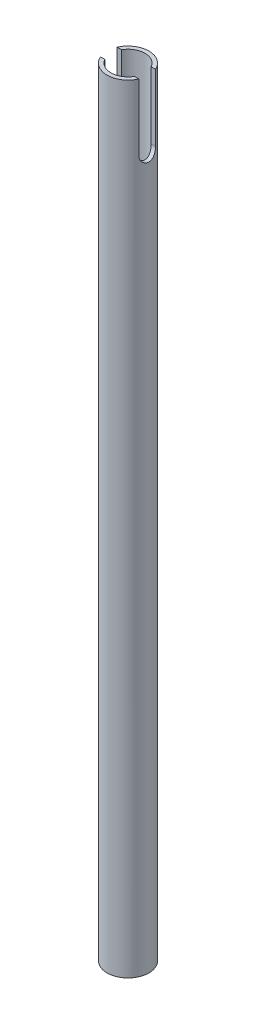
ISO-10303-21;
HEADER;
FILE_DESCRIPTION(('STEP AP214'),'2;1');
FILE_NAME('part.step','',(''),(''),'','','');
FILE_SCHEMA(('AUTOMOTIVE_DESIGN { 1 0 10303 214 1 1 1 1 }'));
ENDSEC;
DATA;
#1=APPLICATION_CONTEXT('core data for automotive mechanical design processes');
#2=APPLICATION_PROTOCOL_DEFINITION('international standard','automotive_design',2000,#1);
#3=PRODUCT_CONTEXT('',#1,'mechanical');
#4=PRODUCT('Part','Part','',(#3));
#5=PRODUCT_RELATED_PRODUCT_CATEGORY('part','',(#4));
#6=PRODUCT_DEFINITION_FORMATION('','',#4);
#7=PRODUCT_DEFINITION_CONTEXT('part definition',#1,'design');
#8=PRODUCT_DEFINITION('design','',#6,#7);
#9=PRODUCT_DEFINITION_SHAPE('','',#8);
#10=(LENGTH_UNIT() NAMED_UNIT(*) SI_UNIT(.MILLI.,.METRE.));
#11=(NAMED_UNIT(*) PLANE_ANGLE_UNIT() SI_UNIT($,.RADIAN.));
#12=(NAMED_UNIT(*) SI_UNIT($,.STERADIAN.) SOLID_ANGLE_UNIT());
#13=UNCERTAINTY_MEASURE_WITH_UNIT(LENGTH_MEASURE(1.E-05),#10,'distance_accuracy_value','');
#14=(GEOMETRIC_REPRESENTATION_CONTEXT(3) GLOBAL_UNCERTAINTY_ASSIGNED_CONTEXT((#13)) GLOBAL_UNIT_ASSIGNED_CONTEXT((#10,
#11,#12)) REPRESENTATION_CONTEXT('',''));
#15=CARTESIAN_POINT('',(0.,0.,0.));
#16=DIRECTION('',(0.,0.,1.));
#17=DIRECTION('',(1.,0.,0.));
#18=AXIS2_PLACEMENT_3D('',#15,#16,#17);
#19=CARTESIAN_POINT('',(5.01899575710646E-13,295.474372218631,3.17499999999929));
#20=DIRECTION('',(0.,1.,0.));
#21=DIRECTION('',(-1.,0.,0.));
#22=AXIS2_PLACEMENT_3D('',#19,#20,#21);
#23=PLANE('',#22);
#24=DIRECTION('',(-1.,0.,0.));
#25=VECTOR('',#24,1.);
#26=CARTESIAN_POINT('',(5.01899575710646E-13,295.474372218631,-3.17500000000002));
#27=LINE('',#26,#25);
#28=CARTESIAN_POINT('',(7.27483891574239,295.474372218631,-3.17500000000002));
#29=VERTEX_POINT('',#28);
#30=CARTESIAN_POINT('',(5.63085690548072,295.474372218631,-3.17500000000002));
#31=VERTEX_POINT('',#30);
#32=EDGE_CURVE('E174',#29,#31,#27,.T.);
#33=ORIENTED_EDGE('',*,*,#32,.F.);
#34=CARTESIAN_POINT('',(0.,295.474372218631,0.));
#35=DIRECTION('',(0.,1.,0.));
#36=DIRECTION('',(0.,0.,1.));
#37=AXIS2_PLACEMENT_3D('',#34,#35,#36);
#38=CIRCLE('',#37,7.9375);
#39=CARTESIAN_POINT('',(-7.27483891574239,295.474372218631,-3.17500000000002));
#40=VERTEX_POINT('',#39);
#41=EDGE_CURVE('E208',#29,#40,#38,.T.);
#42=ORIENTED_EDGE('',*,*,#41,.T.);
#43=CARTESIAN_POINT('',(-5.63085690548072,295.474372218631,-3.17500000000002));
#44=VERTEX_POINT('',#43);
#45=EDGE_CURVE('E175',#44,#40,#27,.T.);
#46=ORIENTED_EDGE('',*,*,#45,.F.);
#47=CARTESIAN_POINT('',(0.,295.474372218631,0.));
#48=DIRECTION('',(0.,1.,0.));
#49=DIRECTION('',(0.,0.,1.));
#50=AXIS2_PLACEMENT_3D('',#47,#48,#49);
#51=CIRCLE('',#50,6.4643);
#52=EDGE_CURVE('E211',#31,#44,#51,.T.);
#53=ORIENTED_EDGE('',*,*,#52,.F.);
#54=EDGE_LOOP('',(#33,#42,#46,#53));
#55=FACE_BOUND('',#54,.T.);
#56=ADVANCED_FACE('F40',(#55),#23,.T.);
#57=CARTESIAN_POINT('',(0.,343.325012521304,0.));
#58=DIRECTION('',(0.,-1.,0.));
#59=DIRECTION('',(0.,0.,-1.));
#60=AXIS2_PLACEMENT_3D('',#57,#58,#59);
#61=CYLINDRICAL_SURFACE('',#60,7.9375);
#62=CARTESIAN_POINT('',(0.,0.,0.));
#63=DIRECTION('',(0.,1.,0.));
#64=DIRECTION('',(0.,0.,1.));
#65=AXIS2_PLACEMENT_3D('',#62,#63,#64);
#66=CIRCLE('',#65,7.9375);
#67=CARTESIAN_POINT('',(0.,0.,7.9375));
#68=VERTEX_POINT('',#67);
#69=EDGE_CURVE('E212',#68,#68,#66,.T.);
#70=ORIENTED_EDGE('',*,*,#69,.T.);
#71=EDGE_LOOP('',(#70));
#72=FACE_BOUND('',#71,.T.);
#73=ORIENTED_EDGE('',*,*,#41,.F.);
#74=DIRECTION('',(0.,-1.,0.));
#75=VECTOR('',#74,1.);
#76=CARTESIAN_POINT('',(7.27483891574239,343.325012521304,-3.175));
#77=LINE('',#76,#75);
#78=CARTESIAN_POINT('',(7.27483891574238,270.074372218631,-3.17500000000003));
#79=VERTEX_POINT('',#78);
#80=EDGE_CURVE('E123',#29,#79,#77,.T.);
#81=ORIENTED_EDGE('',*,*,#80,.T.);
#82=CARTESIAN_POINT('',(7.27483891574239,270.074372218631,-3.17500000000002));
#83=CARTESIAN_POINT('',(7.2748213734673,269.988955427783,-3.17501266882703));
#84=CARTESIAN_POINT('',(7.27634285897749,269.903548224558,-3.17155340043566));
#85=CARTESIAN_POINT('',(7.28233280350349,269.733422782651,-3.15779000732848));
#86=CARTESIAN_POINT('',(7.28680014012065,269.648704294003,-3.1474884895671));
#87=CARTESIAN_POINT('',(7.29852780386515,269.480890389406,-3.12019320836238));
#88=CARTESIAN_POINT('',(7.30577708764083,269.397789903961,-3.10322589952439));
#89=CARTESIAN_POINT('',(7.32282084608482,269.233472243534,-3.06278962927675));
#90=CARTESIAN_POINT('',(7.3326154761132,269.152255183841,-3.03932027099635));
#91=CARTESIAN_POINT('',(7.36535374856867,268.912424055832,-2.95952817722214));
#92=CARTESIAN_POINT('',(7.39167700537415,268.757296127412,-2.89376627017735));
#93=CARTESIAN_POINT('',(7.45033388590046,268.460209235248,-2.7392025415261));
#94=CARTESIAN_POINT('',(7.48267321509131,268.318262965799,-2.65037881684983));
#95=CARTESIAN_POINT('',(7.55175336550834,268.043543163916,-2.44684289232141));
#96=CARTESIAN_POINT('',(7.588634899463,267.911614261791,-2.3310360096301));
#97=CARTESIAN_POINT('',(7.66147804996073,267.668452036475,-2.07914313305182));
#98=CARTESIAN_POINT('',(7.69743947634238,267.557222962052,-1.94305298619929));
#99=CARTESIAN_POINT('',(7.76610424655586,267.354339567927,-1.6478343790749));
#100=CARTESIAN_POINT('',(7.79862271461642,267.263632334241,-1.48800809365193));
#101=CARTESIAN_POINT('',(7.85501261299655,267.110757252924,-1.15383332747064));
#102=CARTESIAN_POINT('',(7.8788876513092,267.048577494279,-0.979490943577513));
#103=CARTESIAN_POINT('',(7.91429574508624,266.957568062663,-0.630185812820644));
#104=CARTESIAN_POINT('',(7.92637039529115,266.927269438129,-0.455661798193266));
#105=CARTESIAN_POINT('',(7.93877492459936,266.896152002657,-0.103613634211565));
#106=CARTESIAN_POINT('',(7.93910896442721,266.895322748145,0.0739094300030562));
#107=CARTESIAN_POINT('',(7.92832361516669,266.922363740071,0.416295487790177));
#108=CARTESIAN_POINT('',(7.91784651916131,266.9486245321,0.581309494992121));
#109=CARTESIAN_POINT('',(7.88748217026596,267.026361732201,0.904358712556954));
#110=CARTESIAN_POINT('',(7.86759438481231,267.077839567344,1.06239352740442));
#111=CARTESIAN_POINT('',(7.81997467816328,267.205182535359,1.36984988491621));
#112=CARTESIAN_POINT('',(7.7921290207194,267.281403625494,1.51910565802054));
#113=CARTESIAN_POINT('',(7.7313568354174,267.45573401569,1.80309420082014));
#114=CARTESIAN_POINT('',(7.69842852631223,267.553850994697,1.9378218508183));
#115=CARTESIAN_POINT('',(7.62828318752465,267.776697788943,2.19831250886753));
#116=CARTESIAN_POINT('',(7.59092651959626,267.902750931418,2.32290812422053));
#117=CARTESIAN_POINT('',(7.51779639956165,268.17409183001,2.54968017957911));
#118=CARTESIAN_POINT('',(7.48202367463434,268.319388300926,2.65184640585691));
#119=CARTESIAN_POINT('',(7.41514238501918,268.630537240665,2.83359604410578));
#120=CARTESIAN_POINT('',(7.38419755733311,268.79686073213,2.9124454400729));
#121=CARTESIAN_POINT('',(7.34535742834898,269.055401605517,3.00845526999255));
#122=CARTESIAN_POINT('',(7.33367552004289,269.14306841374,3.03674359852998));
#123=CARTESIAN_POINT('',(7.31322917691504,269.320834128454,3.08565852812916));
#124=CARTESIAN_POINT('',(7.30446343423191,269.410931925024,3.10628856431505));
#125=CARTESIAN_POINT('',(7.28994070197193,269.596096377062,3.14023004946565));
#126=CARTESIAN_POINT('',(7.2843027635288,269.691225402586,3.15325280299648));
#127=CARTESIAN_POINT('',(7.27673901487912,269.882355977178,3.17064531592315));
#128=CARTESIAN_POINT('',(7.2748109173123,269.978356951918,3.17502040721544));
#129=CARTESIAN_POINT('',(7.27483891574239,270.074372218631,3.175));
#130=B_SPLINE_CURVE_WITH_KNOTS('',3,(#82,#83,#84,#85,#86,#87,#88,#89,#90,#91,#92,#93,#94,#95,
#96,#97,#98,#99,#100,#101,#102,#103,#104,#105,#106,#107,#108,#109,#110,#111,#112,#113,#114,#115,
#116,#117,#118,#119,#120,#121,#122,#123,#124,#125,#126,#127,#128,#129),.UNSPECIFIED.,.F.,.F.,(4,
2,2,2,2,2,2,2,2,2,2,2,2,2,2,2,2,2,2,2,2,2,2,4),(0.,0.256150829294331,0.512204118914609,
0.767251309112382,1.02231407025902,1.53143426526081,2.04103977971416,2.57679901192851,
3.11266809105967,3.66971038544649,4.22651988700747,4.75637028950527,5.28603291779514,
5.7859440297451,6.28588343572725,6.79335980872479,7.30101443548666,7.84196226045962,
8.38315590960402,8.93991483457341,9.21815697205887,9.49627415290113,9.78435582473148,
10.072259818324),.UNSPECIFIED.);
#131=CARTESIAN_POINT('',(7.27483891574239,270.074372218631,3.175));
#132=VERTEX_POINT('',#131);
#133=EDGE_CURVE('E122',#79,#132,#130,.T.);
#134=ORIENTED_EDGE('',*,*,#133,.T.);
#135=DIRECTION('',(0.,-1.,0.));
#136=VECTOR('',#135,1.);
#137=CARTESIAN_POINT('',(7.27483891574239,343.325012521304,3.17500000000002));
#138=LINE('',#137,#136);
#139=CARTESIAN_POINT('',(7.2748389157427,295.474372218631,3.17499999999929));
#140=VERTEX_POINT('',#139);
#141=EDGE_CURVE('E140',#132,#140,#138,.F.);
#142=ORIENTED_EDGE('',*,*,#141,.T.);
#143=CARTESIAN_POINT('',(-7.2748389157427,295.474372218631,3.17499999999929));
#144=VERTEX_POINT('',#143);
#145=EDGE_CURVE('E135',#144,#140,#38,.T.);
#146=ORIENTED_EDGE('',*,*,#145,.F.);
#147=DIRECTION('',(0.,-1.,0.));
#148=VECTOR('',#147,1.);
#149=CARTESIAN_POINT('',(-7.27483891574239,343.325012521304,3.17500000000002));
#150=LINE('',#149,#148);
#151=CARTESIAN_POINT('',(-7.27483891574239,270.074372218631,3.175));
#152=VERTEX_POINT('',#151);
#153=EDGE_CURVE('E62',#144,#152,#150,.T.);
#154=ORIENTED_EDGE('',*,*,#153,.T.);
#155=CARTESIAN_POINT('',(-7.27483891574239,270.074372218631,3.175));
#156=CARTESIAN_POINT('',(-7.2748213734673,269.988955427783,3.17501266882702));
#157=CARTESIAN_POINT('',(-7.27634285897749,269.903548224558,3.17155340043565));
#158=CARTESIAN_POINT('',(-7.2823328035035,269.733422782651,3.15779000732847));
#159=CARTESIAN_POINT('',(-7.28680014012065,269.648704294003,3.14748848956709));
#160=CARTESIAN_POINT('',(-7.29852780386515,269.480890389406,3.12019320836237));
#161=CARTESIAN_POINT('',(-7.30577708764083,269.397789903961,3.10322589952438));
#162=CARTESIAN_POINT('',(-7.32282084608483,269.233472243534,3.06278962927674));
#163=CARTESIAN_POINT('',(-7.3326154761132,269.152255183841,3.03932027099634));
#164=CARTESIAN_POINT('',(-7.36535374856868,268.912424055832,2.95952817722213));
#165=CARTESIAN_POINT('',(-7.39167700537415,268.757296127412,2.89376627017733));
#166=CARTESIAN_POINT('',(-7.45033388590046,268.460209235248,2.73920254152609));
#167=CARTESIAN_POINT('',(-7.48267321509131,268.318262965799,2.65037881684982));
#168=CARTESIAN_POINT('',(-7.55175336550835,268.043543163916,2.4468428923214));
#169=CARTESIAN_POINT('',(-7.588634899463,267.911614261791,2.33103600963009));
#170=CARTESIAN_POINT('',(-7.66147804996073,267.668452036475,2.07914313305181));
#171=CARTESIAN_POINT('',(-7.69743947634239,267.557222962052,1.94305298619927));
#172=CARTESIAN_POINT('',(-7.76610424655586,267.354339567927,1.64783437907489));
#173=CARTESIAN_POINT('',(-7.79862271461643,267.263632334241,1.48800809365192));
#174=CARTESIAN_POINT('',(-7.85501261299655,267.110757252924,1.15383332747063));
#175=CARTESIAN_POINT('',(-7.87888765130921,267.048577494279,0.979490943577501));
#176=CARTESIAN_POINT('',(-7.91429574508624,266.957568062663,0.630185812820632));
#177=CARTESIAN_POINT('',(-7.92637039529115,266.927269438129,0.455661798193254));
#178=CARTESIAN_POINT('',(-7.93877492459936,266.896152002657,0.103613634211553));
#179=CARTESIAN_POINT('',(-7.93910896442721,266.895322748145,-0.0739094300030684));
#180=CARTESIAN_POINT('',(-7.92832361516669,266.922363740071,-0.416295487790189));
#181=CARTESIAN_POINT('',(-7.91784651916131,266.9486245321,-0.581309494992132));
#182=CARTESIAN_POINT('',(-7.88748217026596,267.026361732201,-0.904358712556965));
#183=CARTESIAN_POINT('',(-7.86759438481231,267.077839567344,-1.06239352740443));
#184=CARTESIAN_POINT('',(-7.81997467816327,267.205182535359,-1.36984988491622));
#185=CARTESIAN_POINT('',(-7.7921290207194,267.281403625494,-1.51910565802056));
#186=CARTESIAN_POINT('',(-7.73135683541739,267.45573401569,-1.80309420082015));
#187=CARTESIAN_POINT('',(-7.69842852631223,267.553850994697,-1.93782185081831));
#188=CARTESIAN_POINT('',(-7.62828318752464,267.776697788943,-2.19831250886754));
#189=CARTESIAN_POINT('',(-7.59092651959626,267.902750931418,-2.32290812422054));
#190=CARTESIAN_POINT('',(-7.51779639956165,268.17409183001,-2.54968017957913));
#191=CARTESIAN_POINT('',(-7.48202367463433,268.319388300926,-2.65184640585692));
#192=CARTESIAN_POINT('',(-7.41514238501917,268.630537240665,-2.83359604410579));
#193=CARTESIAN_POINT('',(-7.38419755733311,268.79686073213,-2.91244544007291));
#194=CARTESIAN_POINT('',(-7.34535742834898,269.055401605517,-3.00845526999256));
#195=CARTESIAN_POINT('',(-7.33367552004289,269.14306841374,-3.03674359853));
#196=CARTESIAN_POINT('',(-7.31322917691503,269.320834128454,-3.08565852812917));
#197=CARTESIAN_POINT('',(-7.30446343423191,269.410931925024,-3.10628856431507));
#198=CARTESIAN_POINT('',(-7.28994070197192,269.596096377062,-3.14023004946566));
#199=CARTESIAN_POINT('',(-7.28430276352879,269.691225402586,-3.15325280299649));
#200=CARTESIAN_POINT('',(-7.27673901487911,269.882355977178,-3.17064531592316));
#201=CARTESIAN_POINT('',(-7.27481091731229,269.978356951918,-3.17502040721545));
#202=CARTESIAN_POINT('',(-7.27483891574239,270.074372218631,-3.17500000000002));
#203=B_SPLINE_CURVE_WITH_KNOTS('',3,(#155,#156,#157,#158,#159,#160,#161,#162,#163,#164,#165,
#166,#167,#168,#169,#170,#171,#172,#173,#174,#175,#176,#177,#178,#179,#180,#181,#182,#183,#184,
#185,#186,#187,#188,#189,#190,#191,#192,#193,#194,#195,#196,#197,#198,#199,#200,#201,#202),
.UNSPECIFIED.,.F.,.F.,(4,2,2,2,2,2,2,2,2,2,2,2,2,2,2,2,2,2,2,2,2,2,2,4),(0.,0.256150829294331,
0.512204118914609,0.767251309112382,1.02231407025902,1.53143426526081,2.04103977971416,
2.57679901192851,3.11266809105967,3.66971038544649,4.22651988700747,4.75637028950527,
5.28603291779514,5.7859440297451,6.28588343572725,6.79335980872479,7.30101443548666,
7.84196226045962,8.38315590960402,8.93991483457341,9.21815697205887,9.49627415290113,
9.78435582473148,10.072259818324),.UNSPECIFIED.);
#204=CARTESIAN_POINT('',(-7.27483891574238,270.074372218631,-3.17500000000003));
#205=VERTEX_POINT('',#204);
#206=EDGE_CURVE('E113',#152,#205,#203,.T.);
#207=ORIENTED_EDGE('',*,*,#206,.T.);
#208=DIRECTION('',(0.,-1.,0.));
#209=VECTOR('',#208,1.);
#210=CARTESIAN_POINT('',(-7.27483891574239,343.325012521304,-3.175));
#211=LINE('',#210,#209);
#212=EDGE_CURVE('E138',#205,#40,#211,.F.);
#213=ORIENTED_EDGE('',*,*,#212,.T.);
#214=EDGE_LOOP('',(#73,#81,#134,#142,#146,#154,#207,#213));
#215=FACE_BOUND('',#214,.T.);
#216=ADVANCED_FACE('F42',(#72,#215),#61,.T.);
#217=CARTESIAN_POINT('',(0.,0.,0.));
#218=DIRECTION('',(0.,1.,0.));
#219=DIRECTION('',(0.,0.,1.));
#220=AXIS2_PLACEMENT_3D('',#217,#218,#219);
#221=PLANE('',#220);
#222=ORIENTED_EDGE('',*,*,#69,.F.);
#223=EDGE_LOOP('',(#222));
#224=FACE_BOUND('',#223,.T.);
#225=CARTESIAN_POINT('',(0.,0.,0.));
#226=DIRECTION('',(0.,1.,0.));
#227=DIRECTION('',(0.,0.,1.));
#228=AXIS2_PLACEMENT_3D('',#225,#226,#227);
#229=CIRCLE('',#228,6.4643);
#230=CARTESIAN_POINT('',(0.,0.,6.4643));
#231=VERTEX_POINT('',#230);
#232=EDGE_CURVE('E215',#231,#231,#229,.T.);
#233=ORIENTED_EDGE('',*,*,#232,.T.);
#234=EDGE_LOOP('',(#233));
#235=FACE_BOUND('',#234,.T.);
#236=ADVANCED_FACE('F181',(#224,#235),#221,.F.);
#237=CARTESIAN_POINT('',(0.,343.325012521304,0.));
#238=DIRECTION('',(0.,-1.,0.));
#239=DIRECTION('',(0.,0.,-1.));
#240=AXIS2_PLACEMENT_3D('',#237,#238,#239);
#241=CYLINDRICAL_SURFACE('',#240,6.4643);
#242=DIRECTION('',(0.,-1.,0.));
#243=VECTOR('',#242,1.);
#244=CARTESIAN_POINT('',(-5.63085690548073,343.325012521304,-3.175));
#245=LINE('',#244,#243);
#246=CARTESIAN_POINT('',(-5.63085690548071,270.074372218631,-3.17500000000003));
#247=VERTEX_POINT('',#246);
#248=EDGE_CURVE('E136',#247,#44,#245,.F.);
#249=ORIENTED_EDGE('',*,*,#248,.F.);
#250=CARTESIAN_POINT('',(-5.63085690548073,270.074372218631,3.175));
#251=CARTESIAN_POINT('',(-5.63083314427865,269.990998874,3.17501475658537));
#252=CARTESIAN_POINT('',(-5.63270800290612,269.907638689908,3.17171650894933));
#253=CARTESIAN_POINT('',(-5.64007619078876,269.741640429788,3.15861005673363));
#254=CARTESIAN_POINT('',(-5.64556738634361,269.659001957053,3.14880569084843));
#255=CARTESIAN_POINT('',(-5.65994981136478,269.495498468032,3.12287502503969));
#256=CARTESIAN_POINT('',(-5.66882198481542,269.41462615041,3.10678414485082));
#257=CARTESIAN_POINT('',(-5.68964152520502,269.254761893626,3.06848950606602));
#258=CARTESIAN_POINT('',(-5.70158922758274,269.175770160603,3.0462850806656));
#259=CARTESIAN_POINT('',(-5.74141923049072,268.942705362371,2.97094683956398));
#260=CARTESIAN_POINT('',(-5.77333408209965,268.792065732989,2.90901082020039));
#261=CARTESIAN_POINT('',(-5.84425924105452,268.50321116393,2.76375069900001));
#262=CARTESIAN_POINT('',(-5.88328010907141,268.365015180536,2.6803946868189));
#263=CARTESIAN_POINT('',(-5.96775511660967,268.093074403062,2.48697633404427));
#264=CARTESIAN_POINT('',(-6.01347388807209,267.960537368528,2.37532770540394));
#265=CARTESIAN_POINT('',(-6.10404750316968,267.715162611316,2.13181920715588));
#266=CARTESIAN_POINT('',(-6.14890211569321,267.602330095118,1.99995401300489));
#267=CARTESIAN_POINT('',(-6.23617179606459,267.392397018835,1.70932187954948));
#268=CARTESIAN_POINT('',(-6.27824209999685,267.296783551834,1.54936740140356));
#269=CARTESIAN_POINT('',(-6.35176072116115,267.134376319776,1.21319061658812));
#270=CARTESIAN_POINT('',(-6.38321544776104,267.067565157966,1.03697820811137));
#271=CARTESIAN_POINT('',(-6.43004158193837,266.969439112583,0.686188092188348));
#272=CARTESIAN_POINT('',(-6.4463738522475,266.935991127667,0.512338218857006));
#273=CARTESIAN_POINT('',(-6.46469144763397,266.898530539153,0.160782019690501));
#274=CARTESIAN_POINT('',(-6.46668486855406,266.894501325435,-0.016922073156873));
#275=CARTESIAN_POINT('',(-6.45656772214049,266.915137123323,-0.355165464690638));
#276=CARTESIAN_POINT('',(-6.44562758639317,266.937420734108,-0.51589294515366));
#277=CARTESIAN_POINT('',(-6.41262380355029,267.005807540447,-0.830980900255624));
#278=CARTESIAN_POINT('',(-6.39055953953696,267.051912057056,-0.985341021262244));
#279=CARTESIAN_POINT('',(-6.33694807701977,267.166971300084,-1.28605792480314));
#280=CARTESIAN_POINT('',(-6.30527071175889,267.236241101118,-1.43226999332139));
#281=CARTESIAN_POINT('',(-6.23531544865734,267.395248286922,-1.71135796541494));
#282=CARTESIAN_POINT('',(-6.19703506227319,267.484993392545,-1.844228810978));
#283=CARTESIAN_POINT('',(-6.11334024943196,267.691909289629,-2.10589815284401));
#284=CARTESIAN_POINT('',(-6.06759349912715,267.81084332585,-2.23319819913489));
#285=CARTESIAN_POINT('',(-5.97642079952693,268.067996837284,-2.46684622430579));
#286=CARTESIAN_POINT('',(-5.93099515323759,268.206232488523,-2.57317644688654));
#287=CARTESIAN_POINT('',(-5.84266284464014,268.508435316041,-2.76814528378426));
#288=CARTESIAN_POINT('',(-5.80007313328348,268.673451335094,-2.85533090866609));
#289=CARTESIAN_POINT('',(-5.74498523796175,268.931828153539,-2.96377401450742));
#290=CARTESIAN_POINT('',(-5.72809486991882,269.019716641498,-2.99618869442099));
#291=CARTESIAN_POINT('',(-5.6978812208207,269.198553328082,-3.05325494421092));
#292=CARTESIAN_POINT('',(-5.68455638707003,269.289500175386,-3.07790989407048));
#293=CARTESIAN_POINT('',(-5.65951648210792,269.494617611371,-3.12376274190013));
#294=CARTESIAN_POINT('',(-5.64884707083826,269.609388576667,-3.14291763203009));
#295=CARTESIAN_POINT('',(-5.63809564796982,269.782941683178,-3.1621351306962));
#296=CARTESIAN_POINT('',(-5.63538722073202,269.841081556545,-3.16695519983113));
#297=CARTESIAN_POINT('',(-5.63176603795251,269.957599187777,-3.17338827752119));
#298=CARTESIAN_POINT('',(-5.6308534434139,270.015976966501,-3.17500099852575));
#299=CARTESIAN_POINT('',(-5.63085690548072,270.074372218631,-3.17500000000002));
#300=B_SPLINE_CURVE_WITH_KNOTS('',3,(#250,#251,#252,#253,#254,#255,#256,#257,#258,#259,#260,
#261,#262,#263,#264,#265,#266,#267,#268,#269,#270,#271,#272,#273,#274,#275,#276,#277,#278,#279,
#280,#281,#282,#283,#284,#285,#286,#287,#288,#289,#290,#291,#292,#293,#294,#295,#296,#297,#298,
#299),.UNSPECIFIED.,.F.,.F.,(4,2,2,2,2,2,2,2,2,2,2,2,2,2,2,2,2,2,2,2,2,2,2,2,4),(0.,
0.250012145988229,0.499876912554615,0.74835372511285,0.996857649784888,1.49242784413446,
1.98874063593385,2.52414179614758,3.05968421079775,3.62982161542684,4.19961416973237,
4.73004882970633,5.26018397799675,5.74579693142526,6.23143681875925,6.7239704963093,
7.21669020692482,7.75472587709897,8.29321519372081,8.86416763704423,9.14936329782656,
9.43443456060704,9.78397951274087,9.95908597830926,10.1342081421097),.UNSPECIFIED.);
#301=CARTESIAN_POINT('',(-5.63085690548072,270.074372218631,3.175));
#302=VERTEX_POINT('',#301);
#303=EDGE_CURVE('E12',#302,#247,#300,.T.);
#304=ORIENTED_EDGE('',*,*,#303,.F.);
#305=DIRECTION('',(0.,-1.,0.));
#306=VECTOR('',#305,1.);
#307=CARTESIAN_POINT('',(-5.63085690548072,343.325012521304,3.17500000000002));
#308=LINE('',#307,#306);
#309=CARTESIAN_POINT('',(-5.63085690548113,295.474372218631,3.17499999999929));
#310=VERTEX_POINT('',#309);
#311=EDGE_CURVE('E127',#310,#302,#308,.T.);
#312=ORIENTED_EDGE('',*,*,#311,.F.);
#313=CARTESIAN_POINT('',(5.63085690548113,295.474372218631,3.17499999999929));
#314=VERTEX_POINT('',#313);
#315=EDGE_CURVE('E206',#310,#314,#51,.T.);
#316=ORIENTED_EDGE('',*,*,#315,.T.);
#317=DIRECTION('',(0.,-1.,0.));
#318=VECTOR('',#317,1.);
#319=CARTESIAN_POINT('',(5.63085690548072,343.325012521304,3.17500000000002));
#320=LINE('',#319,#318);
#321=CARTESIAN_POINT('',(5.63085690548072,270.074372218631,3.175));
#322=VERTEX_POINT('',#321);
#323=EDGE_CURVE('E70',#322,#314,#320,.F.);
#324=ORIENTED_EDGE('',*,*,#323,.F.);
#325=CARTESIAN_POINT('',(5.63085690548072,270.074372218631,-3.17500000000002));
#326=CARTESIAN_POINT('',(5.63083314427864,269.990998874,-3.17501475658539));
#327=CARTESIAN_POINT('',(5.63270800290611,269.907638689908,-3.17171650894934));
#328=CARTESIAN_POINT('',(5.64007619078875,269.741640429788,-3.15861005673364));
#329=CARTESIAN_POINT('',(5.6455673863436,269.659001957053,-3.14880569084844));
#330=CARTESIAN_POINT('',(5.65994981136477,269.495498468032,-3.1228750250397));
#331=CARTESIAN_POINT('',(5.66882198481541,269.41462615041,-3.10678414485084));
#332=CARTESIAN_POINT('',(5.68964152520502,269.254761893626,-3.06848950606604));
#333=CARTESIAN_POINT('',(5.70158922758273,269.175770160603,-3.04628508066561));
#334=CARTESIAN_POINT('',(5.74141923049072,268.942705362371,-2.97094683956399));
#335=CARTESIAN_POINT('',(5.77333408209964,268.792065732989,-2.9090108202004));
#336=CARTESIAN_POINT('',(5.84425924105452,268.50321116393,-2.76375069900003));
#337=CARTESIAN_POINT('',(5.8832801090714,268.365015180536,-2.68039468681891));
#338=CARTESIAN_POINT('',(5.96775511660967,268.093074403062,-2.48697633404428));
#339=CARTESIAN_POINT('',(6.01347388807209,267.960537368528,-2.37532770540395));
#340=CARTESIAN_POINT('',(6.10404750316968,267.715162611316,-2.13181920715589));
#341=CARTESIAN_POINT('',(6.14890211569321,267.602330095118,-1.9999540130049));
#342=CARTESIAN_POINT('',(6.23617179606459,267.392397018835,-1.70932187954949));
#343=CARTESIAN_POINT('',(6.27824209999685,267.296783551834,-1.54936740140357));
#344=CARTESIAN_POINT('',(6.35176072116115,267.134376319776,-1.21319061658813));
#345=CARTESIAN_POINT('',(6.38321544776103,267.067565157966,-1.03697820811138));
#346=CARTESIAN_POINT('',(6.43004158193837,266.969439112583,-0.686188092188361));
#347=CARTESIAN_POINT('',(6.4463738522475,266.935991127667,-0.512338218857019));
#348=CARTESIAN_POINT('',(6.46469144763397,266.898530539153,-0.160782019690514));
#349=CARTESIAN_POINT('',(6.46668486855406,266.894501325435,0.0169220731568598));
#350=CARTESIAN_POINT('',(6.45656772214049,266.915137123323,0.355165464690623));
#351=CARTESIAN_POINT('',(6.44562758639317,266.937420734108,0.515892945153643));
#352=CARTESIAN_POINT('',(6.41262380355029,267.005807540447,0.830980900255609));
#353=CARTESIAN_POINT('',(6.39055953953696,267.051912057056,0.985341021262232));
#354=CARTESIAN_POINT('',(6.33694807701977,267.166971300084,1.28605792480312));
#355=CARTESIAN_POINT('',(6.3052707117589,267.236241101118,1.43226999332136));
#356=CARTESIAN_POINT('',(6.23531544865735,267.395248286922,1.71135796541491));
#357=CARTESIAN_POINT('',(6.19703506227319,267.484993392544,1.84422881097799));
#358=CARTESIAN_POINT('',(6.11334024943196,267.691909289629,2.10589815284401));
#359=CARTESIAN_POINT('',(6.06759349912716,267.81084332585,2.23319819913488));
#360=CARTESIAN_POINT('',(5.97642079952694,268.067996837284,2.46684622430577));
#361=CARTESIAN_POINT('',(5.93099515323759,268.206232488523,2.57317644688652));
#362=CARTESIAN_POINT('',(5.84266284464016,268.508435316041,2.76814528378424));
#363=CARTESIAN_POINT('',(5.80007313328349,268.673451335094,2.85533090866606));
#364=CARTESIAN_POINT('',(5.74498523796176,268.931828153539,2.96377401450739));
#365=CARTESIAN_POINT('',(5.72809486991883,269.019716641498,2.99618869442097));
#366=CARTESIAN_POINT('',(5.69788122082071,269.198553328082,3.05325494421091));
#367=CARTESIAN_POINT('',(5.68455638707004,269.289500175386,3.07790989407046));
#368=CARTESIAN_POINT('',(5.65951648210793,269.494617611371,3.12376274190011));
#369=CARTESIAN_POINT('',(5.64884707083826,269.609388576667,3.14291763203008));
#370=CARTESIAN_POINT('',(5.63809564796982,269.782941683178,3.16213513069618));
#371=CARTESIAN_POINT('',(5.63538722073202,269.841081556545,3.16695519983112));
#372=CARTESIAN_POINT('',(5.63176603795252,269.957599187777,3.17338827752118));
#373=CARTESIAN_POINT('',(5.63085344341391,270.015976966501,3.17500099852574));
#374=CARTESIAN_POINT('',(5.63085690548073,270.074372218631,3.175));
#375=B_SPLINE_CURVE_WITH_KNOTS('',3,(#325,#326,#327,#328,#329,#330,#331,#332,#333,#334,#335,
#336,#337,#338,#339,#340,#341,#342,#343,#344,#345,#346,#347,#348,#349,#350,#351,#352,#353,#354,
#355,#356,#357,#358,#359,#360,#361,#362,#363,#364,#365,#366,#367,#368,#369,#370,#371,#372,#373,
#374),.UNSPECIFIED.,.F.,.F.,(4,2,2,2,2,2,2,2,2,2,2,2,2,2,2,2,2,2,2,2,2,2,2,2,4),(0.,
0.250012145988229,0.499876912554615,0.74835372511285,0.996857649784888,1.49242784413446,
1.98874063593385,2.52414179614758,3.05968421079775,3.62982161542684,4.19961416973237,
4.73004882970633,5.26018397799675,5.74579693142526,6.23143681875925,6.72397049630928,
7.21669020692479,7.75472587709898,8.29321519372081,8.86416763704417,9.14936329782657,
9.43443456060704,9.78397951274088,9.95908597830926,10.1342081421097),.UNSPECIFIED.);
#376=CARTESIAN_POINT('',(5.63085690548071,270.074372218631,-3.17500000000003));
#377=VERTEX_POINT('',#376);
#378=EDGE_CURVE('E55',#377,#322,#375,.T.);
#379=ORIENTED_EDGE('',*,*,#378,.F.);
#380=DIRECTION('',(0.,-1.,0.));
#381=VECTOR('',#380,1.);
#382=CARTESIAN_POINT('',(5.63085690548073,343.325012521304,-3.175));
#383=LINE('',#382,#381);
#384=EDGE_CURVE('E145',#31,#377,#383,.T.);
#385=ORIENTED_EDGE('',*,*,#384,.F.);
#386=ORIENTED_EDGE('',*,*,#52,.T.);
#387=EDGE_LOOP('',(#249,#304,#312,#316,#324,#379,#385,#386));
#388=FACE_BOUND('',#387,.T.);
#389=ORIENTED_EDGE('',*,*,#232,.F.);
#390=EDGE_LOOP('',(#389));
#391=FACE_BOUND('',#390,.T.);
#392=ADVANCED_FACE('F177',(#388,#391),#241,.F.);
#393=DIRECTION('',(1.,0.,0.));
#394=VECTOR('',#393,1.);
#395=CARTESIAN_POINT('',(5.01899575710646E-13,295.474372218631,3.17499999999929));
#396=LINE('',#395,#394);
#397=EDGE_CURVE('E204',#144,#310,#396,.T.);
#398=ORIENTED_EDGE('',*,*,#397,.F.);
#399=ORIENTED_EDGE('',*,*,#145,.T.);
#400=EDGE_CURVE('E207',#314,#140,#396,.T.);
#401=ORIENTED_EDGE('',*,*,#400,.F.);
#402=ORIENTED_EDGE('',*,*,#315,.F.);
#403=EDGE_LOOP('',(#398,#399,#401,#402));
#404=FACE_BOUND('',#403,.T.);
#405=ADVANCED_FACE('F180',(#404),#23,.T.);
#406=CARTESIAN_POINT('',(-7.9375,320.874372218631,3.17500000000001));
#407=DIRECTION('',(0.,0.,1.));
#408=DIRECTION('',(0.,-1.,0.));
#409=AXIS2_PLACEMENT_3D('',#406,#407,#408);
#410=PLANE('',#409);
#411=DIRECTION('',(1.,0.,0.));
#412=VECTOR('',#411,1.);
#413=CARTESIAN_POINT('',(-7.9375,270.074372218631,3.175));
#414=LINE('',#413,#412);
#415=EDGE_CURVE('E129',#322,#132,#414,.T.);
#416=ORIENTED_EDGE('',*,*,#415,.F.);
#417=ORIENTED_EDGE('',*,*,#323,.T.);
#418=ORIENTED_EDGE('',*,*,#400,.T.);
#419=ORIENTED_EDGE('',*,*,#141,.F.);
#420=EDGE_LOOP('',(#416,#417,#418,#419));
#421=FACE_BOUND('',#420,.T.);
#422=ADVANCED_FACE('F198',(#421),#410,.F.);
#423=CARTESIAN_POINT('',(-7.9375,320.874372218631,-3.17500000000001));
#424=DIRECTION('',(0.,0.,-1.));
#425=DIRECTION('',(0.,1.,0.));
#426=AXIS2_PLACEMENT_3D('',#423,#424,#425);
#427=PLANE('',#426);
#428=ORIENTED_EDGE('',*,*,#32,.T.);
#429=ORIENTED_EDGE('',*,*,#384,.T.);
#430=DIRECTION('',(1.,0.,0.));
#431=VECTOR('',#430,1.);
#432=CARTESIAN_POINT('',(-7.9375,270.074372218631,-3.17500000000003));
#433=LINE('',#432,#431);
#434=EDGE_CURVE('E128',#377,#79,#433,.T.);
#435=ORIENTED_EDGE('',*,*,#434,.T.);
#436=ORIENTED_EDGE('',*,*,#80,.F.);
#437=EDGE_LOOP('',(#428,#429,#435,#436));
#438=FACE_BOUND('',#437,.T.);
#439=ADVANCED_FACE('F163',(#438),#427,.F.);
#440=CARTESIAN_POINT('',(-7.9375,270.074372218631,0.));
#441=DIRECTION('',(1.,0.,0.));
#442=DIRECTION('',(0.,0.,-1.));
#443=AXIS2_PLACEMENT_3D('',#440,#441,#442);
#444=CYLINDRICAL_SURFACE('',#443,3.17500000000001);
#445=ORIENTED_EDGE('',*,*,#434,.F.);
#446=ORIENTED_EDGE('',*,*,#378,.T.);
#447=ORIENTED_EDGE('',*,*,#415,.T.);
#448=ORIENTED_EDGE('',*,*,#133,.F.);
#449=EDGE_LOOP('',(#445,#446,#447,#448));
#450=FACE_BOUND('',#449,.T.);
#451=ADVANCED_FACE('F158',(#450),#444,.F.);
#452=EDGE_CURVE('E115',#152,#302,#414,.T.);
#453=ORIENTED_EDGE('',*,*,#452,.T.);
#454=ORIENTED_EDGE('',*,*,#303,.T.);
#455=EDGE_CURVE('E118',#205,#247,#433,.T.);
#456=ORIENTED_EDGE('',*,*,#455,.F.);
#457=ORIENTED_EDGE('',*,*,#206,.F.);
#458=EDGE_LOOP('',(#453,#454,#456,#457));
#459=FACE_BOUND('',#458,.T.);
#460=ADVANCED_FACE('F114',(#459),#444,.F.);
#461=ORIENTED_EDGE('',*,*,#455,.T.);
#462=ORIENTED_EDGE('',*,*,#248,.T.);
#463=ORIENTED_EDGE('',*,*,#45,.T.);
#464=ORIENTED_EDGE('',*,*,#212,.F.);
#465=EDGE_LOOP('',(#461,#462,#463,#464));
#466=FACE_BOUND('',#465,.T.);
#467=ADVANCED_FACE('F222',(#466),#427,.F.);
#468=ORIENTED_EDGE('',*,*,#397,.T.);
#469=ORIENTED_EDGE('',*,*,#311,.T.);
#470=ORIENTED_EDGE('',*,*,#452,.F.);
#471=ORIENTED_EDGE('',*,*,#153,.F.);
#472=EDGE_LOOP('',(#468,#469,#470,#471));
#473=FACE_BOUND('',#472,.T.);
#474=ADVANCED_FACE('F125',(#473),#410,.F.);
#475=CLOSED_SHELL('',(#56,#216,#236,#392,#405,#422,#439,#451,#460,#467,#474));
#476=MANIFOLD_SOLID_BREP('B2',#475);
#477=ADVANCED_BREP_SHAPE_REPRESENTATION('',(#18,#476),#14);
#478=SHAPE_DEFINITION_REPRESENTATION(#9,#477);
ENDSEC;
END-ISO-10303-21;
